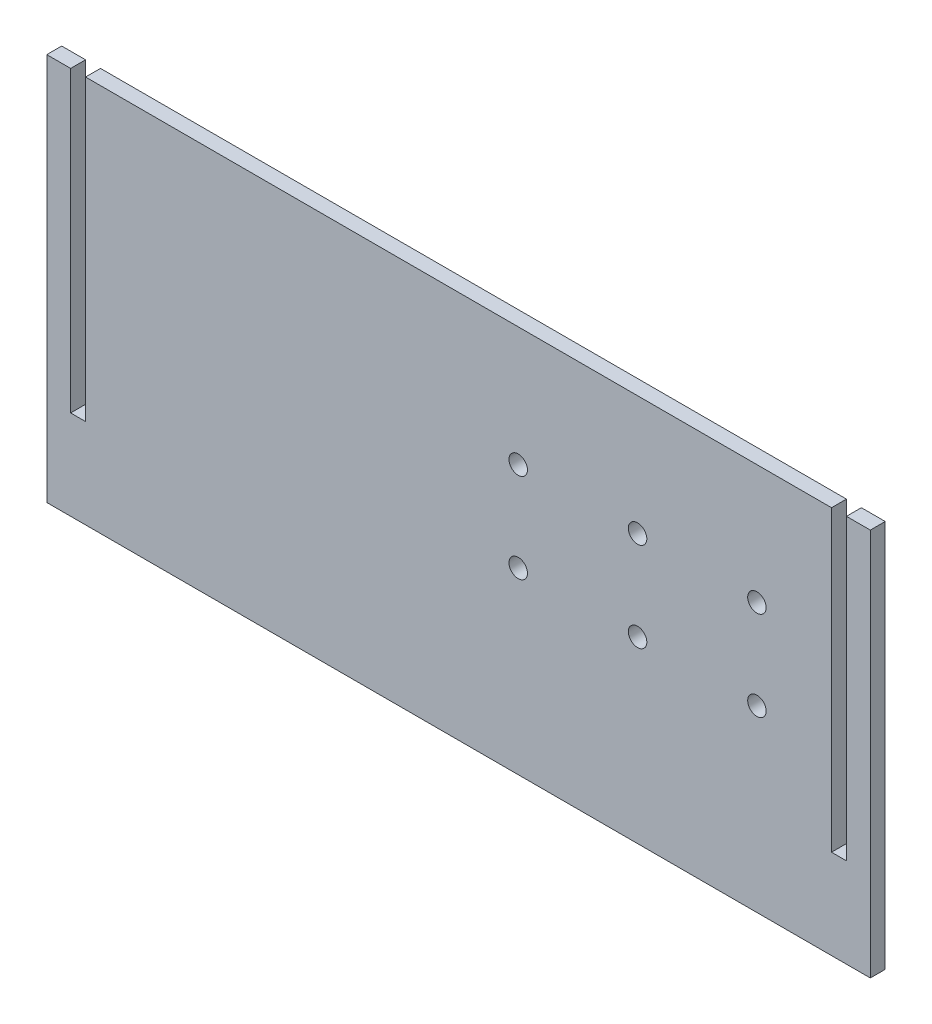
ISO-10303-21;
HEADER;
FILE_DESCRIPTION(('STEP AP214'),'2;1');
FILE_NAME('part.step','',(''),(''),'','','');
FILE_SCHEMA(('AUTOMOTIVE_DESIGN { 1 0 10303 214 1 1 1 1 }'));
ENDSEC;
DATA;
#1=APPLICATION_CONTEXT('core data for automotive mechanical design processes');
#2=APPLICATION_PROTOCOL_DEFINITION('international standard','automotive_design',2000,#1);
#3=PRODUCT_CONTEXT('',#1,'mechanical');
#4=PRODUCT('Part','Part','',(#3));
#5=PRODUCT_RELATED_PRODUCT_CATEGORY('part','',(#4));
#6=PRODUCT_DEFINITION_FORMATION('','',#4);
#7=PRODUCT_DEFINITION_CONTEXT('part definition',#1,'design');
#8=PRODUCT_DEFINITION('design','',#6,#7);
#9=PRODUCT_DEFINITION_SHAPE('','',#8);
#10=(LENGTH_UNIT() NAMED_UNIT(*) SI_UNIT(.MILLI.,.METRE.));
#11=(NAMED_UNIT(*) PLANE_ANGLE_UNIT() SI_UNIT($,.RADIAN.));
#12=(NAMED_UNIT(*) SI_UNIT($,.STERADIAN.) SOLID_ANGLE_UNIT());
#13=UNCERTAINTY_MEASURE_WITH_UNIT(LENGTH_MEASURE(1.E-05),#10,'distance_accuracy_value','');
#14=(GEOMETRIC_REPRESENTATION_CONTEXT(3) GLOBAL_UNCERTAINTY_ASSIGNED_CONTEXT((#13)) GLOBAL_UNIT_ASSIGNED_CONTEXT((#10,
#11,#12)) REPRESENTATION_CONTEXT('',''));
#15=CARTESIAN_POINT('',(0.,0.,0.));
#16=DIRECTION('',(0.,0.,1.));
#17=DIRECTION('',(1.,0.,0.));
#18=AXIS2_PLACEMENT_3D('',#15,#16,#17);
#19=CARTESIAN_POINT('',(0.,0.,2.5));
#20=DIRECTION('',(0.,-1.,0.));
#21=DIRECTION('',(0.,0.,-1.));
#22=AXIS2_PLACEMENT_3D('',#19,#20,#21);
#23=PLANE('',#22);
#24=DIRECTION('',(-1.,0.,0.));
#25=VECTOR('',#24,1.);
#26=CARTESIAN_POINT('',(0.,0.,2.5));
#27=LINE('',#26,#25);
#28=CARTESIAN_POINT('',(4.,0.,2.5));
#29=VERTEX_POINT('',#28);
#30=CARTESIAN_POINT('',(0.,0.,2.5));
#31=VERTEX_POINT('',#30);
#32=EDGE_CURVE('E195',#29,#31,#27,.T.);
#33=ORIENTED_EDGE('',*,*,#32,.F.);
#34=DIRECTION('',(0.,0.,1.));
#35=VECTOR('',#34,1.);
#36=CARTESIAN_POINT('',(4.,0.,0.));
#37=LINE('',#36,#35);
#38=CARTESIAN_POINT('',(4.,0.,0.));
#39=VERTEX_POINT('',#38);
#40=EDGE_CURVE('E158',#39,#29,#37,.T.);
#41=ORIENTED_EDGE('',*,*,#40,.F.);
#42=DIRECTION('',(-1.,0.,0.));
#43=VECTOR('',#42,1.);
#44=CARTESIAN_POINT('',(0.,0.,0.));
#45=LINE('',#44,#43);
#46=CARTESIAN_POINT('',(0.,0.,0.));
#47=VERTEX_POINT('',#46);
#48=EDGE_CURVE('E145',#39,#47,#45,.T.);
#49=ORIENTED_EDGE('',*,*,#48,.T.);
#50=DIRECTION('',(0.,0.,-1.));
#51=VECTOR('',#50,1.);
#52=CARTESIAN_POINT('',(0.,0.,2.5));
#53=LINE('',#52,#51);
#54=EDGE_CURVE('E199',#31,#47,#53,.T.);
#55=ORIENTED_EDGE('',*,*,#54,.F.);
#56=EDGE_LOOP('',(#33,#41,#49,#55));
#57=FACE_BOUND('',#56,.T.);
#58=ADVANCED_FACE('F36',(#57),#23,.F.);
#59=CARTESIAN_POINT('',(131.5,0.,0.));
#60=VERTEX_POINT('',#59);
#61=CARTESIAN_POINT('',(6.5,0.,0.));
#62=VERTEX_POINT('',#61);
#63=EDGE_CURVE('E209',#60,#62,#45,.T.);
#64=ORIENTED_EDGE('',*,*,#63,.T.);
#65=DIRECTION('',(0.,0.,1.));
#66=VECTOR('',#65,1.);
#67=CARTESIAN_POINT('',(6.5,0.,0.));
#68=LINE('',#67,#66);
#69=CARTESIAN_POINT('',(6.5,0.,2.5));
#70=VERTEX_POINT('',#69);
#71=EDGE_CURVE('E161',#62,#70,#68,.T.);
#72=ORIENTED_EDGE('',*,*,#71,.T.);
#73=CARTESIAN_POINT('',(131.5,0.,2.5));
#74=VERTEX_POINT('',#73);
#75=EDGE_CURVE('E200',#74,#70,#27,.T.);
#76=ORIENTED_EDGE('',*,*,#75,.F.);
#77=DIRECTION('',(0.,0.,-1.));
#78=VECTOR('',#77,1.);
#79=CARTESIAN_POINT('',(131.5,0.,2.5));
#80=LINE('',#79,#78);
#81=EDGE_CURVE('E183',#74,#60,#80,.T.);
#82=ORIENTED_EDGE('',*,*,#81,.T.);
#83=EDGE_LOOP('',(#64,#72,#76,#82));
#84=FACE_BOUND('',#83,.T.);
#85=ADVANCED_FACE('F243',(#84),#23,.F.);
#86=CARTESIAN_POINT('',(0.,0.,2.5));
#87=DIRECTION('',(1.,0.,0.));
#88=DIRECTION('',(0.,1.,0.));
#89=AXIS2_PLACEMENT_3D('',#86,#87,#88);
#90=PLANE('',#89);
#91=DIRECTION('',(0.,-1.,0.));
#92=VECTOR('',#91,1.);
#93=CARTESIAN_POINT('',(0.,0.,0.));
#94=LINE('',#93,#92);
#95=CARTESIAN_POINT('',(0.,-65.,0.));
#96=VERTEX_POINT('',#95);
#97=EDGE_CURVE('E186',#47,#96,#94,.T.);
#98=ORIENTED_EDGE('',*,*,#97,.T.);
#99=DIRECTION('',(0.,0.,-1.));
#100=VECTOR('',#99,1.);
#101=CARTESIAN_POINT('',(0.,-65.,2.5));
#102=LINE('',#101,#100);
#103=CARTESIAN_POINT('',(0.,-65.,2.5));
#104=VERTEX_POINT('',#103);
#105=EDGE_CURVE('E44',#104,#96,#102,.T.);
#106=ORIENTED_EDGE('',*,*,#105,.F.);
#107=DIRECTION('',(0.,-1.,0.));
#108=VECTOR('',#107,1.);
#109=CARTESIAN_POINT('',(0.,0.,2.5));
#110=LINE('',#109,#108);
#111=EDGE_CURVE('E187',#31,#104,#110,.T.);
#112=ORIENTED_EDGE('',*,*,#111,.F.);
#113=ORIENTED_EDGE('',*,*,#54,.T.);
#114=EDGE_LOOP('',(#98,#106,#112,#113));
#115=FACE_BOUND('',#114,.T.);
#116=ADVANCED_FACE('F38',(#115),#90,.F.);
#117=CARTESIAN_POINT('',(0.,-65.,2.5));
#118=DIRECTION('',(0.,1.,0.));
#119=DIRECTION('',(0.,0.,1.));
#120=AXIS2_PLACEMENT_3D('',#117,#118,#119);
#121=PLANE('',#120);
#122=DIRECTION('',(1.,0.,0.));
#123=VECTOR('',#122,1.);
#124=CARTESIAN_POINT('',(0.,-65.,0.));
#125=LINE('',#124,#123);
#126=CARTESIAN_POINT('',(138.,-65.,0.));
#127=VERTEX_POINT('',#126);
#128=EDGE_CURVE('E203',#96,#127,#125,.T.);
#129=ORIENTED_EDGE('',*,*,#128,.T.);
#130=DIRECTION('',(0.,0.,-1.));
#131=VECTOR('',#130,1.);
#132=CARTESIAN_POINT('',(138.,-65.,2.5));
#133=LINE('',#132,#131);
#134=CARTESIAN_POINT('',(138.,-65.,2.5));
#135=VERTEX_POINT('',#134);
#136=EDGE_CURVE('E215',#135,#127,#133,.T.);
#137=ORIENTED_EDGE('',*,*,#136,.F.);
#138=DIRECTION('',(1.,0.,0.));
#139=VECTOR('',#138,1.);
#140=CARTESIAN_POINT('',(0.,-65.,2.5));
#141=LINE('',#140,#139);
#142=EDGE_CURVE('E190',#104,#135,#141,.T.);
#143=ORIENTED_EDGE('',*,*,#142,.F.);
#144=ORIENTED_EDGE('',*,*,#105,.T.);
#145=EDGE_LOOP('',(#129,#137,#143,#144));
#146=FACE_BOUND('',#145,.T.);
#147=ADVANCED_FACE('F220',(#146),#121,.F.);
#148=CARTESIAN_POINT('',(138.,0.,2.5));
#149=DIRECTION('',(-1.,0.,0.));
#150=DIRECTION('',(0.,0.,1.));
#151=AXIS2_PLACEMENT_3D('',#148,#149,#150);
#152=PLANE('',#151);
#153=DIRECTION('',(0.,1.,0.));
#154=VECTOR('',#153,1.);
#155=CARTESIAN_POINT('',(138.,0.,0.));
#156=LINE('',#155,#154);
#157=CARTESIAN_POINT('',(138.,0.,0.));
#158=VERTEX_POINT('',#157);
#159=EDGE_CURVE('E205',#127,#158,#156,.T.);
#160=ORIENTED_EDGE('',*,*,#159,.T.);
#161=DIRECTION('',(0.,0.,-1.));
#162=VECTOR('',#161,1.);
#163=CARTESIAN_POINT('',(138.,0.,2.5));
#164=LINE('',#163,#162);
#165=CARTESIAN_POINT('',(138.,0.,2.5));
#166=VERTEX_POINT('',#165);
#167=EDGE_CURVE('E212',#166,#158,#164,.T.);
#168=ORIENTED_EDGE('',*,*,#167,.F.);
#169=DIRECTION('',(0.,1.,0.));
#170=VECTOR('',#169,1.);
#171=CARTESIAN_POINT('',(138.,0.,2.5));
#172=LINE('',#171,#170);
#173=EDGE_CURVE('E193',#135,#166,#172,.T.);
#174=ORIENTED_EDGE('',*,*,#173,.F.);
#175=ORIENTED_EDGE('',*,*,#136,.T.);
#176=EDGE_LOOP('',(#160,#168,#174,#175));
#177=FACE_BOUND('',#176,.T.);
#178=ADVANCED_FACE('F229',(#177),#152,.F.);
#179=CARTESIAN_POINT('',(134.,0.,0.));
#180=VERTEX_POINT('',#179);
#181=EDGE_CURVE('E191',#158,#180,#45,.T.);
#182=ORIENTED_EDGE('',*,*,#181,.T.);
#183=DIRECTION('',(0.,0.,1.));
#184=VECTOR('',#183,1.);
#185=CARTESIAN_POINT('',(134.,0.,2.5));
#186=LINE('',#185,#184);
#187=CARTESIAN_POINT('',(134.,0.,2.5));
#188=VERTEX_POINT('',#187);
#189=EDGE_CURVE('E160',#180,#188,#186,.T.);
#190=ORIENTED_EDGE('',*,*,#189,.T.);
#191=EDGE_CURVE('E196',#166,#188,#27,.T.);
#192=ORIENTED_EDGE('',*,*,#191,.F.);
#193=ORIENTED_EDGE('',*,*,#167,.T.);
#194=EDGE_LOOP('',(#182,#190,#192,#193));
#195=FACE_BOUND('',#194,.T.);
#196=ADVANCED_FACE('F233',(#195),#23,.F.);
#197=CARTESIAN_POINT('',(0.,0.,2.5));
#198=DIRECTION('',(0.,0.,1.));
#199=DIRECTION('',(1.,0.,0.));
#200=AXIS2_PLACEMENT_3D('',#197,#198,#199);
#201=PLANE('',#200);
#202=CARTESIAN_POINT('',(119.,-20.,2.5));
#203=DIRECTION('',(0.,0.,1.));
#204=DIRECTION('',(1.,0.,0.));
#205=AXIS2_PLACEMENT_3D('',#202,#203,#204);
#206=CIRCLE('',#205,1.54999999999999);
#207=CARTESIAN_POINT('',(120.55,-20.,2.5));
#208=VERTEX_POINT('',#207);
#209=EDGE_CURVE('E452',#208,#208,#206,.T.);
#210=ORIENTED_EDGE('',*,*,#209,.F.);
#211=EDGE_LOOP('',(#210));
#212=FACE_BOUND('',#211,.T.);
#213=CARTESIAN_POINT('',(99.,-20.,2.5));
#214=DIRECTION('',(0.,0.,1.));
#215=DIRECTION('',(1.,0.,0.));
#216=AXIS2_PLACEMENT_3D('',#213,#214,#215);
#217=CIRCLE('',#216,1.54999999999999);
#218=CARTESIAN_POINT('',(100.55,-20.,2.5));
#219=VERTEX_POINT('',#218);
#220=EDGE_CURVE('E455',#219,#219,#217,.T.);
#221=ORIENTED_EDGE('',*,*,#220,.F.);
#222=EDGE_LOOP('',(#221));
#223=FACE_BOUND('',#222,.T.);
#224=CARTESIAN_POINT('',(99.,-35.,2.5));
#225=DIRECTION('',(0.,0.,1.));
#226=DIRECTION('',(1.,0.,0.));
#227=AXIS2_PLACEMENT_3D('',#224,#225,#226);
#228=CIRCLE('',#227,1.54999999999999);
#229=CARTESIAN_POINT('',(100.55,-35.,2.5));
#230=VERTEX_POINT('',#229);
#231=EDGE_CURVE('E466',#230,#230,#228,.T.);
#232=ORIENTED_EDGE('',*,*,#231,.F.);
#233=EDGE_LOOP('',(#232));
#234=FACE_BOUND('',#233,.T.);
#235=CARTESIAN_POINT('',(79.,-35.,2.5));
#236=DIRECTION('',(0.,0.,1.));
#237=DIRECTION('',(1.,0.,0.));
#238=AXIS2_PLACEMENT_3D('',#235,#236,#237);
#239=CIRCLE('',#238,1.54999999999999);
#240=CARTESIAN_POINT('',(80.55,-35.,2.5));
#241=VERTEX_POINT('',#240);
#242=EDGE_CURVE('E472',#241,#241,#239,.T.);
#243=ORIENTED_EDGE('',*,*,#242,.F.);
#244=EDGE_LOOP('',(#243));
#245=FACE_BOUND('',#244,.T.);
#246=CARTESIAN_POINT('',(79.,-20.,2.5));
#247=DIRECTION('',(0.,0.,1.));
#248=DIRECTION('',(1.,0.,0.));
#249=AXIS2_PLACEMENT_3D('',#246,#247,#248);
#250=CIRCLE('',#249,1.54999999999999);
#251=CARTESIAN_POINT('',(80.55,-20.,2.5));
#252=VERTEX_POINT('',#251);
#253=EDGE_CURVE('E477',#252,#252,#250,.T.);
#254=ORIENTED_EDGE('',*,*,#253,.F.);
#255=EDGE_LOOP('',(#254));
#256=FACE_BOUND('',#255,.T.);
#257=CARTESIAN_POINT('',(119.,-35.,2.5));
#258=DIRECTION('',(0.,0.,1.));
#259=DIRECTION('',(1.,0.,0.));
#260=AXIS2_PLACEMENT_3D('',#257,#258,#259);
#261=CIRCLE('',#260,1.54999999999999);
#262=CARTESIAN_POINT('',(120.55,-35.,2.5));
#263=VERTEX_POINT('',#262);
#264=EDGE_CURVE('E151',#263,#263,#261,.T.);
#265=ORIENTED_EDGE('',*,*,#264,.F.);
#266=EDGE_LOOP('',(#265));
#267=FACE_BOUND('',#266,.T.);
#268=DIRECTION('',(0.,-1.,0.));
#269=VECTOR('',#268,1.);
#270=CARTESIAN_POINT('',(4.,0.,2.5));
#271=LINE('',#270,#269);
#272=CARTESIAN_POINT('',(4.00000000000001,-50.,2.5));
#273=VERTEX_POINT('',#272);
#274=EDGE_CURVE('E131',#29,#273,#271,.T.);
#275=ORIENTED_EDGE('',*,*,#274,.F.);
#276=ORIENTED_EDGE('',*,*,#32,.T.);
#277=ORIENTED_EDGE('',*,*,#111,.T.);
#278=ORIENTED_EDGE('',*,*,#142,.T.);
#279=ORIENTED_EDGE('',*,*,#173,.T.);
#280=ORIENTED_EDGE('',*,*,#191,.T.);
#281=DIRECTION('',(0.,1.,0.));
#282=VECTOR('',#281,1.);
#283=CARTESIAN_POINT('',(134.,0.00245473613038813,2.5));
#284=LINE('',#283,#282);
#285=CARTESIAN_POINT('',(134.,-49.9975452638696,2.5));
#286=VERTEX_POINT('',#285);
#287=EDGE_CURVE('E171',#286,#188,#284,.T.);
#288=ORIENTED_EDGE('',*,*,#287,.F.);
#289=DIRECTION('',(1.,0.,0.));
#290=VECTOR('',#289,1.);
#291=CARTESIAN_POINT('',(131.5,-49.9975452638696,2.5));
#292=LINE('',#291,#290);
#293=CARTESIAN_POINT('',(131.5,-49.9975452638696,2.5));
#294=VERTEX_POINT('',#293);
#295=EDGE_CURVE('E173',#294,#286,#292,.T.);
#296=ORIENTED_EDGE('',*,*,#295,.F.);
#297=DIRECTION('',(0.,-1.,0.));
#298=VECTOR('',#297,1.);
#299=CARTESIAN_POINT('',(131.5,0.00245473613038813,2.5));
#300=LINE('',#299,#298);
#301=EDGE_CURVE('E156',#74,#294,#300,.T.);
#302=ORIENTED_EDGE('',*,*,#301,.F.);
#303=ORIENTED_EDGE('',*,*,#75,.T.);
#304=DIRECTION('',(0.,1.,0.));
#305=VECTOR('',#304,1.);
#306=CARTESIAN_POINT('',(6.5,0.,2.5));
#307=LINE('',#306,#305);
#308=CARTESIAN_POINT('',(6.50000000000001,-50.,2.5));
#309=VERTEX_POINT('',#308);
#310=EDGE_CURVE('E146',#309,#70,#307,.T.);
#311=ORIENTED_EDGE('',*,*,#310,.F.);
#312=DIRECTION('',(1.,0.,0.));
#313=VECTOR('',#312,1.);
#314=CARTESIAN_POINT('',(4.00000000000001,-50.,2.5));
#315=LINE('',#314,#313);
#316=EDGE_CURVE('E148',#273,#309,#315,.T.);
#317=ORIENTED_EDGE('',*,*,#316,.F.);
#318=EDGE_LOOP('',(#275,#276,#277,#278,#279,#280,#288,#296,#302,#303,#311,#317));
#319=FACE_BOUND('',#318,.T.);
#320=ADVANCED_FACE('F236',(#212,#223,#234,#245,#256,#267,#319),#201,.T.);
#321=CARTESIAN_POINT('',(0.,0.,0.));
#322=DIRECTION('',(0.,0.,1.));
#323=DIRECTION('',(1.,0.,0.));
#324=AXIS2_PLACEMENT_3D('',#321,#322,#323);
#325=PLANE('',#324);
#326=CARTESIAN_POINT('',(119.,-20.,0.));
#327=DIRECTION('',(0.,0.,1.));
#328=DIRECTION('',(1.,0.,0.));
#329=AXIS2_PLACEMENT_3D('',#326,#327,#328);
#330=CIRCLE('',#329,1.54999999999999);
#331=CARTESIAN_POINT('',(120.55,-20.,0.));
#332=VERTEX_POINT('',#331);
#333=EDGE_CURVE('E449',#332,#332,#330,.T.);
#334=ORIENTED_EDGE('',*,*,#333,.T.);
#335=EDGE_LOOP('',(#334));
#336=FACE_BOUND('',#335,.T.);
#337=CARTESIAN_POINT('',(99.,-20.,0.));
#338=DIRECTION('',(0.,0.,1.));
#339=DIRECTION('',(1.,0.,0.));
#340=AXIS2_PLACEMENT_3D('',#337,#338,#339);
#341=CIRCLE('',#340,1.54999999999999);
#342=CARTESIAN_POINT('',(100.55,-20.,0.));
#343=VERTEX_POINT('',#342);
#344=EDGE_CURVE('E463',#343,#343,#341,.T.);
#345=ORIENTED_EDGE('',*,*,#344,.T.);
#346=EDGE_LOOP('',(#345));
#347=FACE_BOUND('',#346,.T.);
#348=CARTESIAN_POINT('',(99.,-35.,0.));
#349=DIRECTION('',(0.,0.,1.));
#350=DIRECTION('',(1.,0.,0.));
#351=AXIS2_PLACEMENT_3D('',#348,#349,#350);
#352=CIRCLE('',#351,1.54999999999999);
#353=CARTESIAN_POINT('',(100.55,-35.,0.));
#354=VERTEX_POINT('',#353);
#355=EDGE_CURVE('E469',#354,#354,#352,.T.);
#356=ORIENTED_EDGE('',*,*,#355,.T.);
#357=EDGE_LOOP('',(#356));
#358=FACE_BOUND('',#357,.T.);
#359=CARTESIAN_POINT('',(79.,-35.,0.));
#360=DIRECTION('',(0.,0.,1.));
#361=DIRECTION('',(1.,0.,0.));
#362=AXIS2_PLACEMENT_3D('',#359,#360,#361);
#363=CIRCLE('',#362,1.54999999999999);
#364=CARTESIAN_POINT('',(80.55,-35.,0.));
#365=VERTEX_POINT('',#364);
#366=EDGE_CURVE('E475',#365,#365,#363,.T.);
#367=ORIENTED_EDGE('',*,*,#366,.T.);
#368=EDGE_LOOP('',(#367));
#369=FACE_BOUND('',#368,.T.);
#370=CARTESIAN_POINT('',(79.,-20.,0.));
#371=DIRECTION('',(0.,0.,1.));
#372=DIRECTION('',(1.,0.,0.));
#373=AXIS2_PLACEMENT_3D('',#370,#371,#372);
#374=CIRCLE('',#373,1.54999999999999);
#375=CARTESIAN_POINT('',(80.55,-20.,0.));
#376=VERTEX_POINT('',#375);
#377=EDGE_CURVE('E458',#376,#376,#374,.T.);
#378=ORIENTED_EDGE('',*,*,#377,.T.);
#379=EDGE_LOOP('',(#378));
#380=FACE_BOUND('',#379,.T.);
#381=CARTESIAN_POINT('',(119.,-35.,0.));
#382=DIRECTION('',(0.,0.,1.));
#383=DIRECTION('',(1.,0.,0.));
#384=AXIS2_PLACEMENT_3D('',#381,#382,#383);
#385=CIRCLE('',#384,1.54999999999999);
#386=CARTESIAN_POINT('',(120.55,-35.,0.));
#387=VERTEX_POINT('',#386);
#388=EDGE_CURVE('E170',#387,#387,#385,.T.);
#389=ORIENTED_EDGE('',*,*,#388,.T.);
#390=EDGE_LOOP('',(#389));
#391=FACE_BOUND('',#390,.T.);
#392=ORIENTED_EDGE('',*,*,#48,.F.);
#393=DIRECTION('',(0.,-1.,0.));
#394=VECTOR('',#393,1.);
#395=CARTESIAN_POINT('',(4.,0.,0.));
#396=LINE('',#395,#394);
#397=CARTESIAN_POINT('',(4.00000000000001,-50.,0.));
#398=VERTEX_POINT('',#397);
#399=EDGE_CURVE('E128',#39,#398,#396,.T.);
#400=ORIENTED_EDGE('',*,*,#399,.T.);
#401=DIRECTION('',(1.,0.,0.));
#402=VECTOR('',#401,1.);
#403=CARTESIAN_POINT('',(4.00000000000001,-50.,0.));
#404=LINE('',#403,#402);
#405=CARTESIAN_POINT('',(6.50000000000001,-50.,0.));
#406=VERTEX_POINT('',#405);
#407=EDGE_CURVE('E138',#398,#406,#404,.T.);
#408=ORIENTED_EDGE('',*,*,#407,.T.);
#409=DIRECTION('',(0.,1.,0.));
#410=VECTOR('',#409,1.);
#411=CARTESIAN_POINT('',(6.5,0.,0.));
#412=LINE('',#411,#410);
#413=EDGE_CURVE('E51',#406,#62,#412,.T.);
#414=ORIENTED_EDGE('',*,*,#413,.T.);
#415=ORIENTED_EDGE('',*,*,#63,.F.);
#416=DIRECTION('',(0.,-1.,0.));
#417=VECTOR('',#416,1.);
#418=CARTESIAN_POINT('',(131.5,0.,0.));
#419=LINE('',#418,#417);
#420=CARTESIAN_POINT('',(131.5,-49.9975452638696,0.));
#421=VERTEX_POINT('',#420);
#422=EDGE_CURVE('E11',#60,#421,#419,.T.);
#423=ORIENTED_EDGE('',*,*,#422,.T.);
#424=DIRECTION('',(1.,0.,0.));
#425=VECTOR('',#424,1.);
#426=CARTESIAN_POINT('',(131.5,-49.9975452638696,0.));
#427=LINE('',#426,#425);
#428=CARTESIAN_POINT('',(134.,-49.9975452638696,0.));
#429=VERTEX_POINT('',#428);
#430=EDGE_CURVE('E174',#421,#429,#427,.T.);
#431=ORIENTED_EDGE('',*,*,#430,.T.);
#432=DIRECTION('',(0.,1.,0.));
#433=VECTOR('',#432,1.);
#434=CARTESIAN_POINT('',(134.,0.00245473613038813,0.));
#435=LINE('',#434,#433);
#436=EDGE_CURVE('E59',#429,#180,#435,.T.);
#437=ORIENTED_EDGE('',*,*,#436,.T.);
#438=ORIENTED_EDGE('',*,*,#181,.F.);
#439=ORIENTED_EDGE('',*,*,#159,.F.);
#440=ORIENTED_EDGE('',*,*,#128,.F.);
#441=ORIENTED_EDGE('',*,*,#97,.F.);
#442=EDGE_LOOP('',(#392,#400,#408,#414,#415,#423,#431,#437,#438,#439,#440,#441));
#443=FACE_BOUND('',#442,.T.);
#444=ADVANCED_FACE('F143',(#336,#347,#358,#369,#380,#391,#443),#325,.F.);
#445=CARTESIAN_POINT('',(131.5,0.00245473613038813,0.));
#446=DIRECTION('',(-1.,0.,0.));
#447=DIRECTION('',(0.,-1.,0.));
#448=AXIS2_PLACEMENT_3D('',#445,#446,#447);
#449=PLANE('',#448);
#450=ORIENTED_EDGE('',*,*,#301,.T.);
#451=DIRECTION('',(0.,0.,1.));
#452=VECTOR('',#451,1.);
#453=CARTESIAN_POINT('',(131.5,-49.9975452638696,0.));
#454=LINE('',#453,#452);
#455=EDGE_CURVE('E165',#421,#294,#454,.T.);
#456=ORIENTED_EDGE('',*,*,#455,.F.);
#457=ORIENTED_EDGE('',*,*,#422,.F.);
#458=ORIENTED_EDGE('',*,*,#81,.F.);
#459=EDGE_LOOP('',(#450,#456,#457,#458));
#460=FACE_BOUND('',#459,.T.);
#461=ADVANCED_FACE('F248',(#460),#449,.F.);
#462=CARTESIAN_POINT('',(134.,0.00245473613038813,0.));
#463=DIRECTION('',(1.,0.,0.));
#464=DIRECTION('',(0.,0.,-1.));
#465=AXIS2_PLACEMENT_3D('',#462,#463,#464);
#466=PLANE('',#465);
#467=ORIENTED_EDGE('',*,*,#436,.F.);
#468=DIRECTION('',(0.,0.,1.));
#469=VECTOR('',#468,1.);
#470=CARTESIAN_POINT('',(134.,-49.9975452638696,0.));
#471=LINE('',#470,#469);
#472=EDGE_CURVE('E168',#429,#286,#471,.T.);
#473=ORIENTED_EDGE('',*,*,#472,.T.);
#474=ORIENTED_EDGE('',*,*,#287,.T.);
#475=ORIENTED_EDGE('',*,*,#189,.F.);
#476=EDGE_LOOP('',(#467,#473,#474,#475));
#477=FACE_BOUND('',#476,.T.);
#478=ADVANCED_FACE('F252',(#477),#466,.F.);
#479=CARTESIAN_POINT('',(131.5,-49.9975452638696,0.));
#480=DIRECTION('',(0.,-1.,0.));
#481=DIRECTION('',(0.,0.,-1.));
#482=AXIS2_PLACEMENT_3D('',#479,#480,#481);
#483=PLANE('',#482);
#484=ORIENTED_EDGE('',*,*,#295,.T.);
#485=ORIENTED_EDGE('',*,*,#472,.F.);
#486=ORIENTED_EDGE('',*,*,#430,.F.);
#487=ORIENTED_EDGE('',*,*,#455,.T.);
#488=EDGE_LOOP('',(#484,#485,#486,#487));
#489=FACE_BOUND('',#488,.T.);
#490=ADVANCED_FACE('F251',(#489),#483,.F.);
#491=CARTESIAN_POINT('',(4.,0.,0.));
#492=DIRECTION('',(-1.,0.,0.));
#493=DIRECTION('',(0.,-1.,0.));
#494=AXIS2_PLACEMENT_3D('',#491,#492,#493);
#495=PLANE('',#494);
#496=ORIENTED_EDGE('',*,*,#274,.T.);
#497=DIRECTION('',(0.,0.,1.));
#498=VECTOR('',#497,1.);
#499=CARTESIAN_POINT('',(4.00000000000001,-50.,0.));
#500=LINE('',#499,#498);
#501=EDGE_CURVE('E124',#398,#273,#500,.T.);
#502=ORIENTED_EDGE('',*,*,#501,.F.);
#503=ORIENTED_EDGE('',*,*,#399,.F.);
#504=ORIENTED_EDGE('',*,*,#40,.T.);
#505=EDGE_LOOP('',(#496,#502,#503,#504));
#506=FACE_BOUND('',#505,.T.);
#507=ADVANCED_FACE('F126',(#506),#495,.F.);
#508=CARTESIAN_POINT('',(6.5,0.,0.));
#509=DIRECTION('',(1.,0.,0.));
#510=DIRECTION('',(0.,1.,0.));
#511=AXIS2_PLACEMENT_3D('',#508,#509,#510);
#512=PLANE('',#511);
#513=ORIENTED_EDGE('',*,*,#310,.T.);
#514=ORIENTED_EDGE('',*,*,#71,.F.);
#515=ORIENTED_EDGE('',*,*,#413,.F.);
#516=DIRECTION('',(0.,0.,1.));
#517=VECTOR('',#516,1.);
#518=CARTESIAN_POINT('',(6.50000000000001,-50.,0.));
#519=LINE('',#518,#517);
#520=EDGE_CURVE('E135',#406,#309,#519,.T.);
#521=ORIENTED_EDGE('',*,*,#520,.T.);
#522=EDGE_LOOP('',(#513,#514,#515,#521));
#523=FACE_BOUND('',#522,.T.);
#524=ADVANCED_FACE('F327',(#523),#512,.F.);
#525=CARTESIAN_POINT('',(4.00000000000001,-50.,0.));
#526=DIRECTION('',(0.,-1.,0.));
#527=DIRECTION('',(0.,0.,-1.));
#528=AXIS2_PLACEMENT_3D('',#525,#526,#527);
#529=PLANE('',#528);
#530=ORIENTED_EDGE('',*,*,#316,.T.);
#531=ORIENTED_EDGE('',*,*,#520,.F.);
#532=ORIENTED_EDGE('',*,*,#407,.F.);
#533=ORIENTED_EDGE('',*,*,#501,.T.);
#534=EDGE_LOOP('',(#530,#531,#532,#533));
#535=FACE_BOUND('',#534,.T.);
#536=ADVANCED_FACE('F139',(#535),#529,.F.);
#537=CARTESIAN_POINT('',(119.,-35.,0.));
#538=DIRECTION('',(0.,0.,1.));
#539=DIRECTION('',(1.,0.,0.));
#540=AXIS2_PLACEMENT_3D('',#537,#538,#539);
#541=CYLINDRICAL_SURFACE('',#540,1.54999999999999);
#542=ORIENTED_EDGE('',*,*,#388,.F.);
#543=EDGE_LOOP('',(#542));
#544=FACE_BOUND('',#543,.T.);
#545=ORIENTED_EDGE('',*,*,#264,.T.);
#546=EDGE_LOOP('',(#545));
#547=FACE_BOUND('',#546,.T.);
#548=ADVANCED_FACE('F346',(#544,#547),#541,.F.);
#549=CARTESIAN_POINT('',(79.,-20.,0.));
#550=DIRECTION('',(0.,0.,1.));
#551=DIRECTION('',(1.,0.,0.));
#552=AXIS2_PLACEMENT_3D('',#549,#550,#551);
#553=CYLINDRICAL_SURFACE('',#552,1.54999999999999);
#554=ORIENTED_EDGE('',*,*,#377,.F.);
#555=EDGE_LOOP('',(#554));
#556=FACE_BOUND('',#555,.T.);
#557=ORIENTED_EDGE('',*,*,#253,.T.);
#558=EDGE_LOOP('',(#557));
#559=FACE_BOUND('',#558,.T.);
#560=ADVANCED_FACE('F369',(#556,#559),#553,.F.);
#561=CARTESIAN_POINT('',(79.,-35.,0.));
#562=DIRECTION('',(0.,0.,1.));
#563=DIRECTION('',(1.,0.,0.));
#564=AXIS2_PLACEMENT_3D('',#561,#562,#563);
#565=CYLINDRICAL_SURFACE('',#564,1.54999999999999);
#566=ORIENTED_EDGE('',*,*,#366,.F.);
#567=EDGE_LOOP('',(#566));
#568=FACE_BOUND('',#567,.T.);
#569=ORIENTED_EDGE('',*,*,#242,.T.);
#570=EDGE_LOOP('',(#569));
#571=FACE_BOUND('',#570,.T.);
#572=ADVANCED_FACE('F380',(#568,#571),#565,.F.);
#573=CARTESIAN_POINT('',(99.,-35.,0.));
#574=DIRECTION('',(0.,0.,1.));
#575=DIRECTION('',(1.,0.,0.));
#576=AXIS2_PLACEMENT_3D('',#573,#574,#575);
#577=CYLINDRICAL_SURFACE('',#576,1.54999999999999);
#578=ORIENTED_EDGE('',*,*,#355,.F.);
#579=EDGE_LOOP('',(#578));
#580=FACE_BOUND('',#579,.T.);
#581=ORIENTED_EDGE('',*,*,#231,.T.);
#582=EDGE_LOOP('',(#581));
#583=FACE_BOUND('',#582,.T.);
#584=ADVANCED_FACE('F391',(#580,#583),#577,.F.);
#585=CARTESIAN_POINT('',(99.,-20.,0.));
#586=DIRECTION('',(0.,0.,1.));
#587=DIRECTION('',(1.,0.,0.));
#588=AXIS2_PLACEMENT_3D('',#585,#586,#587);
#589=CYLINDRICAL_SURFACE('',#588,1.54999999999999);
#590=ORIENTED_EDGE('',*,*,#344,.F.);
#591=EDGE_LOOP('',(#590));
#592=FACE_BOUND('',#591,.T.);
#593=ORIENTED_EDGE('',*,*,#220,.T.);
#594=EDGE_LOOP('',(#593));
#595=FACE_BOUND('',#594,.T.);
#596=ADVANCED_FACE('F402',(#592,#595),#589,.F.);
#597=CARTESIAN_POINT('',(119.,-20.,0.));
#598=DIRECTION('',(0.,0.,1.));
#599=DIRECTION('',(1.,0.,0.));
#600=AXIS2_PLACEMENT_3D('',#597,#598,#599);
#601=CYLINDRICAL_SURFACE('',#600,1.54999999999999);
#602=ORIENTED_EDGE('',*,*,#333,.F.);
#603=EDGE_LOOP('',(#602));
#604=FACE_BOUND('',#603,.T.);
#605=ORIENTED_EDGE('',*,*,#209,.T.);
#606=EDGE_LOOP('',(#605));
#607=FACE_BOUND('',#606,.T.);
#608=ADVANCED_FACE('F413',(#604,#607),#601,.F.);
#609=CLOSED_SHELL('',(#58,#85,#116,#147,#178,#196,#320,#444,#461,#478,#490,#507,#524,#536,#548,
#560,#572,#584,#596,#608));
#610=MANIFOLD_SOLID_BREP('B2',#609);
#611=ADVANCED_BREP_SHAPE_REPRESENTATION('',(#18,#610),#14);
#612=SHAPE_DEFINITION_REPRESENTATION(#9,#611);
ENDSEC;
END-ISO-10303-21;
